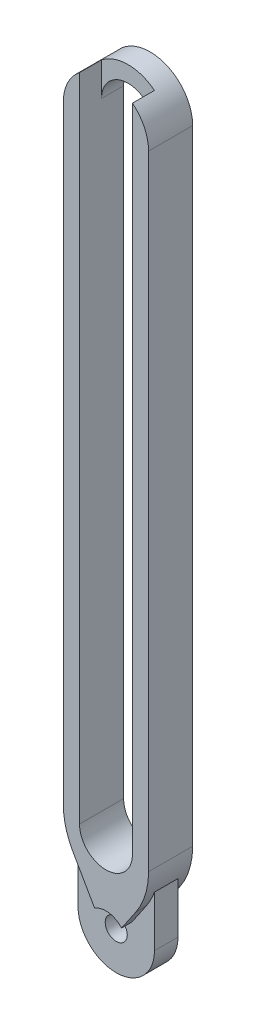
ISO-10303-21;
HEADER;
FILE_DESCRIPTION(('STEP AP214'),'2;1');
FILE_NAME('part.step','',(''),(''),'','','');
FILE_SCHEMA(('AUTOMOTIVE_DESIGN { 1 0 10303 214 1 1 1 1 }'));
ENDSEC;
DATA;
#1=APPLICATION_CONTEXT('core data for automotive mechanical design processes');
#2=APPLICATION_PROTOCOL_DEFINITION('international standard','automotive_design',2000,#1);
#3=PRODUCT_CONTEXT('',#1,'mechanical');
#4=PRODUCT('Part','Part','',(#3));
#5=PRODUCT_RELATED_PRODUCT_CATEGORY('part','',(#4));
#6=PRODUCT_DEFINITION_FORMATION('','',#4);
#7=PRODUCT_DEFINITION_CONTEXT('part definition',#1,'design');
#8=PRODUCT_DEFINITION('design','',#6,#7);
#9=PRODUCT_DEFINITION_SHAPE('','',#8);
#10=(LENGTH_UNIT() NAMED_UNIT(*) SI_UNIT(.MILLI.,.METRE.));
#11=(NAMED_UNIT(*) PLANE_ANGLE_UNIT() SI_UNIT($,.RADIAN.));
#12=(NAMED_UNIT(*) SI_UNIT($,.STERADIAN.) SOLID_ANGLE_UNIT());
#13=UNCERTAINTY_MEASURE_WITH_UNIT(LENGTH_MEASURE(1.E-05),#10,'distance_accuracy_value','');
#14=(GEOMETRIC_REPRESENTATION_CONTEXT(3) GLOBAL_UNCERTAINTY_ASSIGNED_CONTEXT((#13)) GLOBAL_UNIT_ASSIGNED_CONTEXT((#10,
#11,#12)) REPRESENTATION_CONTEXT('',''));
#15=CARTESIAN_POINT('',(0.,0.,0.));
#16=DIRECTION('',(0.,0.,1.));
#17=DIRECTION('',(1.,0.,0.));
#18=AXIS2_PLACEMENT_3D('',#15,#16,#17);
#19=CARTESIAN_POINT('',(0.,182.011383905916,-7.5));
#20=DIRECTION('',(0.,0.,1.));
#21=DIRECTION('',(1.,0.,0.));
#22=AXIS2_PLACEMENT_3D('',#19,#20,#21);
#23=CYLINDRICAL_SURFACE('',#22,9.);
#24=CARTESIAN_POINT('',(0.,182.011383905916,0.));
#25=DIRECTION('',(0.,0.,1.));
#26=DIRECTION('',(1.,0.,0.));
#27=AXIS2_PLACEMENT_3D('',#24,#25,#26);
#28=CIRCLE('',#27,9.);
#29=CARTESIAN_POINT('',(-9.,182.011383905916,0.));
#30=VERTEX_POINT('',#29);
#31=CARTESIAN_POINT('',(9.,182.011383905916,0.));
#32=VERTEX_POINT('',#31);
#33=EDGE_CURVE('E185',#30,#32,#28,.F.);
#34=ORIENTED_EDGE('',*,*,#33,.F.);
#35=DIRECTION('',(0.,0.,1.));
#36=VECTOR('',#35,1.);
#37=CARTESIAN_POINT('',(-9.,182.011383905916,-7.5));
#38=LINE('',#37,#36);
#39=CARTESIAN_POINT('',(-9.,182.011383905916,-7.5));
#40=VERTEX_POINT('',#39);
#41=EDGE_CURVE('E221',#40,#30,#38,.T.);
#42=ORIENTED_EDGE('',*,*,#41,.F.);
#43=CARTESIAN_POINT('',(0.,182.011383905916,-7.5));
#44=DIRECTION('',(0.,0.,1.));
#45=DIRECTION('',(1.,0.,0.));
#46=AXIS2_PLACEMENT_3D('',#43,#44,#45);
#47=CIRCLE('',#46,9.);
#48=CARTESIAN_POINT('',(9.,182.011383905916,-7.5));
#49=VERTEX_POINT('',#48);
#50=EDGE_CURVE('E206',#49,#40,#47,.T.);
#51=ORIENTED_EDGE('',*,*,#50,.F.);
#52=DIRECTION('',(0.,0.,1.));
#53=VECTOR('',#52,1.);
#54=CARTESIAN_POINT('',(9.,182.011383905916,-7.5));
#55=LINE('',#54,#53);
#56=EDGE_CURVE('E200',#49,#32,#55,.T.);
#57=ORIENTED_EDGE('',*,*,#56,.T.);
#58=EDGE_LOOP('',(#34,#42,#51,#57));
#59=FACE_BOUND('',#58,.T.);
#60=ADVANCED_FACE('F37',(#59),#23,.F.);
#61=CARTESIAN_POINT('',(5.29445936964023,-51.4874567844259,7.5));
#62=DIRECTION('',(0.826176472958624,-0.563411426516758,0.));
#63=DIRECTION('',(0.563411426516758,0.826176472958624,0.));
#64=AXIS2_PLACEMENT_3D('',#61,#62,#63);
#65=PLANE('',#64);
#66=DIRECTION('',(-0.563411426516758,-0.826176472958624,0.));
#67=VECTOR('',#66,1.);
#68=CARTESIAN_POINT('',(5.29445936964023,-51.4874567844259,-7.5));
#69=LINE('',#68,#67);
#70=CARTESIAN_POINT('',(10.1544118239656,-44.3609091347187,-7.5));
#71=VERTEX_POINT('',#70);
#72=CARTESIAN_POINT('',(5.29445936964023,-51.4874567844259,-7.5));
#73=VERTEX_POINT('',#72);
#74=EDGE_CURVE('E230',#71,#73,#69,.T.);
#75=ORIENTED_EDGE('',*,*,#74,.F.);
#76=DIRECTION('',(0.,0.,-1.));
#77=VECTOR('',#76,1.);
#78=CARTESIAN_POINT('',(10.1544118239656,-44.3609091347187,7.5));
#79=LINE('',#78,#77);
#80=CARTESIAN_POINT('',(10.1544118239656,-44.3609091347187,-4.));
#81=VERTEX_POINT('',#80);
#82=EDGE_CURVE('E328',#71,#81,#79,.F.);
#83=ORIENTED_EDGE('',*,*,#82,.T.);
#84=DIRECTION('',(-0.563411426516758,-0.826176472958624,0.));
#85=VECTOR('',#84,1.);
#86=CARTESIAN_POINT('',(5.29445936964023,-51.4874567844259,-4.));
#87=LINE('',#86,#85);
#88=CARTESIAN_POINT('',(5.29445936964023,-51.4874567844259,-4.));
#89=VERTEX_POINT('',#88);
#90=EDGE_CURVE('E239',#81,#89,#87,.T.);
#91=ORIENTED_EDGE('',*,*,#90,.T.);
#92=DIRECTION('',(0.,0.,1.));
#93=VECTOR('',#92,1.);
#94=CARTESIAN_POINT('',(5.29445936964023,-51.4874567844259,-7.5));
#95=LINE('',#94,#93);
#96=EDGE_CURVE('E244',#73,#89,#95,.T.);
#97=ORIENTED_EDGE('',*,*,#96,.F.);
#98=EDGE_LOOP('',(#75,#83,#91,#97));
#99=FACE_BOUND('',#98,.T.);
#100=ADVANCED_FACE('F387',(#99),#65,.T.);
#101=CARTESIAN_POINT('',(-3.84583251699359,-50.2177211342446,7.5));
#102=DIRECTION('',(-0.868365907058973,-0.495924037991352,0.));
#103=DIRECTION('',(0.495924037991352,-0.868365907058973,0.));
#104=AXIS2_PLACEMENT_3D('',#101,#102,#103);
#105=PLANE('',#104);
#106=DIRECTION('',(-0.495924037991352,0.868365907058973,0.));
#107=VECTOR('',#106,1.);
#108=CARTESIAN_POINT('',(-3.84583251699359,-50.2177211342446,7.5));
#109=LINE('',#108,#107);
#110=CARTESIAN_POINT('',(-3.84583251699359,-50.2177211342446,7.5));
#111=VERTEX_POINT('',#110);
#112=CARTESIAN_POINT('',(-11.2091476764743,-37.3245129862358,7.5));
#113=VERTEX_POINT('',#112);
#114=EDGE_CURVE('E250',#111,#113,#109,.T.);
#115=ORIENTED_EDGE('',*,*,#114,.T.);
#116=DIRECTION('',(0.,0.,-1.));
#117=VECTOR('',#116,1.);
#118=CARTESIAN_POINT('',(-11.2091476764743,-37.3245129862358,-7.5));
#119=LINE('',#118,#117);
#120=CARTESIAN_POINT('',(-11.2091476764743,-37.3245129862358,4.));
#121=VERTEX_POINT('',#120);
#122=EDGE_CURVE('E310',#113,#121,#119,.T.);
#123=ORIENTED_EDGE('',*,*,#122,.T.);
#124=DIRECTION('',(-0.495924037991352,0.868365907058973,0.));
#125=VECTOR('',#124,1.);
#126=CARTESIAN_POINT('',(-3.84583251699359,-50.2177211342446,4.));
#127=LINE('',#126,#125);
#128=CARTESIAN_POINT('',(-3.84583251699359,-50.2177211342446,4.));
#129=VERTEX_POINT('',#128);
#130=EDGE_CURVE('E259',#129,#121,#127,.T.);
#131=ORIENTED_EDGE('',*,*,#130,.F.);
#132=DIRECTION('',(0.,0.,-1.));
#133=VECTOR('',#132,1.);
#134=CARTESIAN_POINT('',(-3.84583251699359,-50.2177211342446,7.5));
#135=LINE('',#134,#133);
#136=EDGE_CURVE('E265',#111,#129,#135,.T.);
#137=ORIENTED_EDGE('',*,*,#136,.F.);
#138=EDGE_LOOP('',(#115,#123,#131,#137));
#139=FACE_BOUND('',#138,.T.);
#140=ADVANCED_FACE('F362',(#139),#105,.T.);
#141=CARTESIAN_POINT('',(-14.5,182.011383905916,7.5));
#142=DIRECTION('',(1.,0.,0.));
#143=DIRECTION('',(0.,1.,0.));
#144=AXIS2_PLACEMENT_3D('',#141,#142,#143);
#145=PLANE('',#144);
#146=DIRECTION('',(0.,-1.,0.));
#147=VECTOR('',#146,1.);
#148=CARTESIAN_POINT('',(-14.5,182.011383905916,-7.5));
#149=LINE('',#148,#147);
#150=CARTESIAN_POINT('',(-14.5,182.011383905916,-7.5));
#151=VERTEX_POINT('',#150);
#152=CARTESIAN_POINT('',(-14.5,-24.926412036452,-7.5));
#153=VERTEX_POINT('',#152);
#154=EDGE_CURVE('E298',#151,#153,#149,.T.);
#155=ORIENTED_EDGE('',*,*,#154,.T.);
#156=DIRECTION('',(0.,0.,-1.));
#157=VECTOR('',#156,1.);
#158=CARTESIAN_POINT('',(-14.5,-24.926412036452,7.5));
#159=LINE('',#158,#157);
#160=CARTESIAN_POINT('',(-14.5,-24.926412036452,7.5));
#161=VERTEX_POINT('',#160);
#162=EDGE_CURVE('E317',#153,#161,#159,.F.);
#163=ORIENTED_EDGE('',*,*,#162,.T.);
#164=DIRECTION('',(0.,-1.,0.));
#165=VECTOR('',#164,1.);
#166=CARTESIAN_POINT('',(-14.5,182.011383905916,7.5));
#167=LINE('',#166,#165);
#168=CARTESIAN_POINT('',(-14.5,182.011383905916,7.5));
#169=VERTEX_POINT('',#168);
#170=EDGE_CURVE('E289',#169,#161,#167,.T.);
#171=ORIENTED_EDGE('',*,*,#170,.F.);
#172=DIRECTION('',(0.,0.,-1.));
#173=VECTOR('',#172,1.);
#174=CARTESIAN_POINT('',(-14.5,182.011383905916,7.5));
#175=LINE('',#174,#173);
#176=EDGE_CURVE('E305',#169,#151,#175,.T.);
#177=ORIENTED_EDGE('',*,*,#176,.T.);
#178=EDGE_LOOP('',(#155,#163,#171,#177));
#179=FACE_BOUND('',#178,.T.);
#180=ADVANCED_FACE('F409',(#179),#145,.F.);
#181=CARTESIAN_POINT('',(0.,182.011383905916,7.5));
#182=DIRECTION('',(0.,0.,1.));
#183=DIRECTION('',(1.,0.,0.));
#184=AXIS2_PLACEMENT_3D('',#181,#182,#183);
#185=PLANE('',#184);
#186=DIRECTION('',(0.,-1.,0.));
#187=VECTOR('',#186,1.);
#188=CARTESIAN_POINT('',(-9.,182.011383905916,7.5));
#189=LINE('',#188,#187);
#190=CARTESIAN_POINT('',(-9.,193.380200906818,7.5));
#191=VERTEX_POINT('',#190);
#192=CARTESIAN_POINT('',(-8.99999999999998,-27.988616094084,7.5));
#193=VERTEX_POINT('',#192);
#194=EDGE_CURVE('E415',#191,#193,#189,.T.);
#195=ORIENTED_EDGE('',*,*,#194,.F.);
#196=CARTESIAN_POINT('',(0.,182.011383905916,7.5));
#197=DIRECTION('',(0.,0.,1.));
#198=DIRECTION('',(1.,0.,0.));
#199=AXIS2_PLACEMENT_3D('',#196,#197,#198);
#200=CIRCLE('',#199,14.5);
#201=EDGE_CURVE('E290',#191,#169,#200,.T.);
#202=ORIENTED_EDGE('',*,*,#201,.T.);
#203=ORIENTED_EDGE('',*,*,#170,.T.);
#204=CARTESIAN_POINT('',(10.5,-24.926412036452,7.5));
#205=DIRECTION('',(0.,0.,1.));
#206=DIRECTION('',(1.,0.,0.));
#207=AXIS2_PLACEMENT_3D('',#204,#205,#206);
#208=CIRCLE('',#207,25.);
#209=EDGE_CURVE('E321',#161,#113,#208,.T.);
#210=ORIENTED_EDGE('',*,*,#209,.T.);
#211=ORIENTED_EDGE('',*,*,#114,.F.);
#212=CARTESIAN_POINT('',(0.,-56.066616094084,7.5));
#213=DIRECTION('',(0.,0.,1.));
#214=DIRECTION('',(1.,0.,0.));
#215=AXIS2_PLACEMENT_3D('',#212,#213,#214);
#216=CIRCLE('',#215,7.);
#217=CARTESIAN_POINT('',(5.29445936964023,-51.4874567844259,7.5));
#218=VERTEX_POINT('',#217);
#219=EDGE_CURVE('E248',#218,#111,#216,.T.);
#220=ORIENTED_EDGE('',*,*,#219,.F.);
#221=DIRECTION('',(-0.563411426516758,-0.826176472958624,0.));
#222=VECTOR('',#221,1.);
#223=CARTESIAN_POINT('',(5.29445936964023,-51.4874567844259,7.5));
#224=LINE('',#223,#222);
#225=CARTESIAN_POINT('',(10.1544118239656,-44.3609091347187,7.5));
#226=VERTEX_POINT('',#225);
#227=EDGE_CURVE('E254',#226,#218,#224,.T.);
#228=ORIENTED_EDGE('',*,*,#227,.F.);
#229=CARTESIAN_POINT('',(-10.5,-30.2756234717997,7.5));
#230=DIRECTION('',(0.,0.,1.));
#231=DIRECTION('',(1.,0.,0.));
#232=AXIS2_PLACEMENT_3D('',#229,#230,#231);
#233=CIRCLE('',#232,25.);
#234=CARTESIAN_POINT('',(14.5,-30.2756234717997,7.5));
#235=VERTEX_POINT('',#234);
#236=EDGE_CURVE('E319',#226,#235,#233,.T.);
#237=ORIENTED_EDGE('',*,*,#236,.T.);
#238=DIRECTION('',(0.,1.,0.));
#239=VECTOR('',#238,1.);
#240=CARTESIAN_POINT('',(14.5,182.011383905916,7.5));
#241=LINE('',#240,#239);
#242=CARTESIAN_POINT('',(14.5,182.011383905916,7.5));
#243=VERTEX_POINT('',#242);
#244=EDGE_CURVE('E293',#235,#243,#241,.T.);
#245=ORIENTED_EDGE('',*,*,#244,.T.);
#246=CARTESIAN_POINT('',(9.,193.380200906818,7.5));
#247=VERTEX_POINT('',#246);
#248=EDGE_CURVE('E286',#243,#247,#200,.T.);
#249=ORIENTED_EDGE('',*,*,#248,.T.);
#250=DIRECTION('',(0.,1.,0.));
#251=VECTOR('',#250,1.);
#252=CARTESIAN_POINT('',(9.,182.011383905916,7.5));
#253=LINE('',#252,#251);
#254=CARTESIAN_POINT('',(9.00000000000003,-27.988616094084,7.5));
#255=VERTEX_POINT('',#254);
#256=EDGE_CURVE('E217',#255,#247,#253,.T.);
#257=ORIENTED_EDGE('',*,*,#256,.F.);
#258=CARTESIAN_POINT('',(0.,-27.988616094084,7.5));
#259=DIRECTION('',(0.,0.,1.));
#260=DIRECTION('',(1.,0.,0.));
#261=AXIS2_PLACEMENT_3D('',#258,#259,#260);
#262=CIRCLE('',#261,9.);
#263=EDGE_CURVE('E417',#193,#255,#262,.T.);
#264=ORIENTED_EDGE('',*,*,#263,.F.);
#265=EDGE_LOOP('',(#195,#202,#203,#210,#211,#220,#228,#237,#245,#249,#257,#264));
#266=FACE_BOUND('',#265,.T.);
#267=ADVANCED_FACE('F405',(#266),#185,.T.);
#268=CARTESIAN_POINT('',(0.,182.011383905916,7.5));
#269=DIRECTION('',(0.,0.,-1.));
#270=DIRECTION('',(-1.,0.,0.));
#271=AXIS2_PLACEMENT_3D('',#268,#269,#270);
#272=CYLINDRICAL_SURFACE('',#271,14.5);
#273=ORIENTED_EDGE('',*,*,#201,.F.);
#274=DIRECTION('',(0.,0.,-1.));
#275=VECTOR('',#274,1.);
#276=CARTESIAN_POINT('',(-9.,193.380200906818,7.5));
#277=LINE('',#276,#275);
#278=CARTESIAN_POINT('',(-9.,193.380200906818,0.));
#279=VERTEX_POINT('',#278);
#280=EDGE_CURVE('E412',#191,#279,#277,.T.);
#281=ORIENTED_EDGE('',*,*,#280,.T.);
#282=CARTESIAN_POINT('',(0.,182.011383905916,0.));
#283=DIRECTION('',(0.,0.,1.));
#284=DIRECTION('',(1.,0.,0.));
#285=AXIS2_PLACEMENT_3D('',#282,#283,#284);
#286=CIRCLE('',#285,14.5);
#287=CARTESIAN_POINT('',(9.,193.380200906818,0.));
#288=VERTEX_POINT('',#287);
#289=EDGE_CURVE('E195',#288,#279,#286,.T.);
#290=ORIENTED_EDGE('',*,*,#289,.F.);
#291=DIRECTION('',(0.,0.,-1.));
#292=VECTOR('',#291,1.);
#293=CARTESIAN_POINT('',(9.,193.380200906818,7.5));
#294=LINE('',#293,#292);
#295=EDGE_CURVE('E203',#288,#247,#294,.F.);
#296=ORIENTED_EDGE('',*,*,#295,.T.);
#297=ORIENTED_EDGE('',*,*,#248,.F.);
#298=DIRECTION('',(0.,0.,-1.));
#299=VECTOR('',#298,1.);
#300=CARTESIAN_POINT('',(14.5,182.011383905916,7.5));
#301=LINE('',#300,#299);
#302=CARTESIAN_POINT('',(14.5,182.011383905916,-7.5));
#303=VERTEX_POINT('',#302);
#304=EDGE_CURVE('E295',#243,#303,#301,.T.);
#305=ORIENTED_EDGE('',*,*,#304,.T.);
#306=CARTESIAN_POINT('',(0.,182.011383905916,-7.5));
#307=DIRECTION('',(0.,0.,1.));
#308=DIRECTION('',(1.,0.,0.));
#309=AXIS2_PLACEMENT_3D('',#306,#307,#308);
#310=CIRCLE('',#309,14.5);
#311=EDGE_CURVE('E285',#303,#151,#310,.T.);
#312=ORIENTED_EDGE('',*,*,#311,.T.);
#313=ORIENTED_EDGE('',*,*,#176,.F.);
#314=EDGE_LOOP('',(#273,#281,#290,#296,#297,#305,#312,#313));
#315=FACE_BOUND('',#314,.T.);
#316=ADVANCED_FACE('F401',(#315),#272,.T.);
#317=CARTESIAN_POINT('',(14.5,182.011383905916,7.5));
#318=DIRECTION('',(-1.,0.,0.));
#319=DIRECTION('',(0.,-1.,0.));
#320=AXIS2_PLACEMENT_3D('',#317,#318,#319);
#321=PLANE('',#320);
#322=ORIENTED_EDGE('',*,*,#244,.F.);
#323=DIRECTION('',(0.,0.,-1.));
#324=VECTOR('',#323,1.);
#325=CARTESIAN_POINT('',(14.5,-30.2756234717997,-7.5));
#326=LINE('',#325,#324);
#327=CARTESIAN_POINT('',(14.5,-30.2756234717997,-7.5));
#328=VERTEX_POINT('',#327);
#329=EDGE_CURVE('E323',#235,#328,#326,.T.);
#330=ORIENTED_EDGE('',*,*,#329,.T.);
#331=DIRECTION('',(0.,1.,0.));
#332=VECTOR('',#331,1.);
#333=CARTESIAN_POINT('',(14.5,182.011383905916,-7.5));
#334=LINE('',#333,#332);
#335=EDGE_CURVE('E301',#328,#303,#334,.T.);
#336=ORIENTED_EDGE('',*,*,#335,.T.);
#337=ORIENTED_EDGE('',*,*,#304,.F.);
#338=EDGE_LOOP('',(#322,#330,#336,#337));
#339=FACE_BOUND('',#338,.T.);
#340=ADVANCED_FACE('F397',(#339),#321,.F.);
#341=CARTESIAN_POINT('',(0.,182.011383905916,-7.5));
#342=DIRECTION('',(0.,0.,1.));
#343=DIRECTION('',(1.,0.,0.));
#344=AXIS2_PLACEMENT_3D('',#341,#342,#343);
#345=PLANE('',#344);
#346=DIRECTION('',(0.,1.,0.));
#347=VECTOR('',#346,1.);
#348=CARTESIAN_POINT('',(9.,182.011383905916,-7.5));
#349=LINE('',#348,#347);
#350=CARTESIAN_POINT('',(9.00000000000003,-27.988616094084,-7.5));
#351=VERTEX_POINT('',#350);
#352=EDGE_CURVE('E222',#351,#49,#349,.T.);
#353=ORIENTED_EDGE('',*,*,#352,.T.);
#354=ORIENTED_EDGE('',*,*,#50,.T.);
#355=DIRECTION('',(0.,-1.,0.));
#356=VECTOR('',#355,1.);
#357=CARTESIAN_POINT('',(-9.,182.011383905916,-7.5));
#358=LINE('',#357,#356);
#359=CARTESIAN_POINT('',(-8.99999999999998,-27.988616094084,-7.5));
#360=VERTEX_POINT('',#359);
#361=EDGE_CURVE('E423',#40,#360,#358,.T.);
#362=ORIENTED_EDGE('',*,*,#361,.T.);
#363=CARTESIAN_POINT('',(0.,-27.988616094084,-7.5));
#364=DIRECTION('',(0.,0.,1.));
#365=DIRECTION('',(1.,0.,0.));
#366=AXIS2_PLACEMENT_3D('',#363,#364,#365);
#367=CIRCLE('',#366,9.);
#368=EDGE_CURVE('E52',#360,#351,#367,.T.);
#369=ORIENTED_EDGE('',*,*,#368,.T.);
#370=EDGE_LOOP('',(#353,#354,#362,#369));
#371=FACE_BOUND('',#370,.T.);
#372=DIRECTION('',(-0.495924037991352,0.868365907058973,0.));
#373=VECTOR('',#372,1.);
#374=CARTESIAN_POINT('',(-3.84583251699359,-50.2177211342446,-7.5));
#375=LINE('',#374,#373);
#376=CARTESIAN_POINT('',(-3.84583251699359,-50.2177211342446,-7.5));
#377=VERTEX_POINT('',#376);
#378=CARTESIAN_POINT('',(-11.2091476764743,-37.3245129862358,-7.5));
#379=VERTEX_POINT('',#378);
#380=EDGE_CURVE('E233',#377,#379,#375,.T.);
#381=ORIENTED_EDGE('',*,*,#380,.T.);
#382=CARTESIAN_POINT('',(10.5,-24.926412036452,-7.5));
#383=DIRECTION('',(0.,0.,1.));
#384=DIRECTION('',(1.,0.,0.));
#385=AXIS2_PLACEMENT_3D('',#382,#383,#384);
#386=CIRCLE('',#385,25.);
#387=EDGE_CURVE('E315',#379,#153,#386,.F.);
#388=ORIENTED_EDGE('',*,*,#387,.T.);
#389=ORIENTED_EDGE('',*,*,#154,.F.);
#390=ORIENTED_EDGE('',*,*,#311,.F.);
#391=ORIENTED_EDGE('',*,*,#335,.F.);
#392=CARTESIAN_POINT('',(-10.5,-30.2756234717997,-7.5));
#393=DIRECTION('',(0.,0.,1.));
#394=DIRECTION('',(1.,0.,0.));
#395=AXIS2_PLACEMENT_3D('',#392,#393,#394);
#396=CIRCLE('',#395,25.);
#397=EDGE_CURVE('E313',#328,#71,#396,.F.);
#398=ORIENTED_EDGE('',*,*,#397,.T.);
#399=ORIENTED_EDGE('',*,*,#74,.T.);
#400=CARTESIAN_POINT('',(0.,-56.066616094084,-7.5));
#401=DIRECTION('',(0.,0.,1.));
#402=DIRECTION('',(1.,0.,0.));
#403=AXIS2_PLACEMENT_3D('',#400,#401,#402);
#404=CIRCLE('',#403,7.);
#405=EDGE_CURVE('E227',#73,#377,#404,.T.);
#406=ORIENTED_EDGE('',*,*,#405,.T.);
#407=EDGE_LOOP('',(#381,#388,#389,#390,#391,#398,#399,#406));
#408=FACE_BOUND('',#407,.T.);
#409=ADVANCED_FACE('F391',(#371,#408),#345,.F.);
#410=CARTESIAN_POINT('',(-13.,-40.066616094084,4.));
#411=DIRECTION('',(1.,0.,0.));
#412=DIRECTION('',(0.,1.,0.));
#413=AXIS2_PLACEMENT_3D('',#410,#411,#412);
#414=PLANE('',#413);
#415=DIRECTION('',(0.,-1.,0.));
#416=VECTOR('',#415,1.);
#417=CARTESIAN_POINT('',(-13.,-40.066616094084,4.));
#418=LINE('',#417,#416);
#419=CARTESIAN_POINT('',(-13.,-33.4557730910679,4.));
#420=VERTEX_POINT('',#419);
#421=CARTESIAN_POINT('',(-13.,-56.066616094084,4.));
#422=VERTEX_POINT('',#421);
#423=EDGE_CURVE('E269',#420,#422,#418,.T.);
#424=ORIENTED_EDGE('',*,*,#423,.F.);
#425=DIRECTION('',(0.,0.,1.));
#426=VECTOR('',#425,1.);
#427=CARTESIAN_POINT('',(-13.,-33.4557730910679,4.));
#428=LINE('',#427,#426);
#429=CARTESIAN_POINT('',(-13.,-33.4557730910679,-4.));
#430=VERTEX_POINT('',#429);
#431=EDGE_CURVE('E333',#420,#430,#428,.F.);
#432=ORIENTED_EDGE('',*,*,#431,.T.);
#433=DIRECTION('',(0.,-1.,0.));
#434=VECTOR('',#433,1.);
#435=CARTESIAN_POINT('',(-13.,-40.066616094084,-4.));
#436=LINE('',#435,#434);
#437=CARTESIAN_POINT('',(-13.,-56.066616094084,-4.));
#438=VERTEX_POINT('',#437);
#439=EDGE_CURVE('E268',#430,#438,#436,.T.);
#440=ORIENTED_EDGE('',*,*,#439,.T.);
#441=DIRECTION('',(0.,0.,-1.));
#442=VECTOR('',#441,1.);
#443=CARTESIAN_POINT('',(-13.,-56.066616094084,4.));
#444=LINE('',#443,#442);
#445=EDGE_CURVE('E282',#422,#438,#444,.T.);
#446=ORIENTED_EDGE('',*,*,#445,.F.);
#447=EDGE_LOOP('',(#424,#432,#440,#446));
#448=FACE_BOUND('',#447,.T.);
#449=ADVANCED_FACE('F372',(#448),#414,.F.);
#450=CARTESIAN_POINT('',(13.,-40.066616094084,4.));
#451=DIRECTION('',(-1.,0.,0.));
#452=DIRECTION('',(0.,-1.,0.));
#453=AXIS2_PLACEMENT_3D('',#450,#451,#452);
#454=PLANE('',#453);
#455=DIRECTION('',(0.,1.,0.));
#456=VECTOR('',#455,1.);
#457=CARTESIAN_POINT('',(13.,-40.066616094084,-4.));
#458=LINE('',#457,#456);
#459=CARTESIAN_POINT('',(13.,-56.066616094084,-4.));
#460=VERTEX_POINT('',#459);
#461=CARTESIAN_POINT('',(13.,-38.8049845264158,-4.));
#462=VERTEX_POINT('',#461);
#463=EDGE_CURVE('E272',#460,#462,#458,.T.);
#464=ORIENTED_EDGE('',*,*,#463,.T.);
#465=DIRECTION('',(0.,0.,1.));
#466=VECTOR('',#465,1.);
#467=CARTESIAN_POINT('',(13.,-38.8049845264158,-4.));
#468=LINE('',#467,#466);
#469=CARTESIAN_POINT('',(13.,-38.8049845264158,4.));
#470=VERTEX_POINT('',#469);
#471=EDGE_CURVE('E45',#462,#470,#468,.T.);
#472=ORIENTED_EDGE('',*,*,#471,.T.);
#473=DIRECTION('',(0.,1.,0.));
#474=VECTOR('',#473,1.);
#475=CARTESIAN_POINT('',(13.,-40.066616094084,4.));
#476=LINE('',#475,#474);
#477=CARTESIAN_POINT('',(13.,-56.066616094084,4.));
#478=VERTEX_POINT('',#477);
#479=EDGE_CURVE('E59',#478,#470,#476,.T.);
#480=ORIENTED_EDGE('',*,*,#479,.F.);
#481=DIRECTION('',(0.,0.,-1.));
#482=VECTOR('',#481,1.);
#483=CARTESIAN_POINT('',(13.,-56.066616094084,4.));
#484=LINE('',#483,#482);
#485=EDGE_CURVE('E275',#478,#460,#484,.T.);
#486=ORIENTED_EDGE('',*,*,#485,.T.);
#487=EDGE_LOOP('',(#464,#472,#480,#486));
#488=FACE_BOUND('',#487,.T.);
#489=ADVANCED_FACE('F343',(#488),#454,.F.);
#490=CARTESIAN_POINT('',(0.,-56.066616094084,4.));
#491=DIRECTION('',(0.,0.,-1.));
#492=DIRECTION('',(-1.,0.,0.));
#493=AXIS2_PLACEMENT_3D('',#490,#491,#492);
#494=CYLINDRICAL_SURFACE('',#493,13.);
#495=CARTESIAN_POINT('',(0.,-56.066616094084,-4.));
#496=DIRECTION('',(0.,0.,1.));
#497=DIRECTION('',(1.,0.,0.));
#498=AXIS2_PLACEMENT_3D('',#495,#496,#497);
#499=CIRCLE('',#498,13.);
#500=EDGE_CURVE('E277',#438,#460,#499,.T.);
#501=ORIENTED_EDGE('',*,*,#500,.T.);
#502=ORIENTED_EDGE('',*,*,#485,.F.);
#503=CARTESIAN_POINT('',(0.,-56.066616094084,4.));
#504=DIRECTION('',(0.,0.,1.));
#505=DIRECTION('',(1.,0.,0.));
#506=AXIS2_PLACEMENT_3D('',#503,#504,#505);
#507=CIRCLE('',#506,13.);
#508=EDGE_CURVE('E271',#422,#478,#507,.T.);
#509=ORIENTED_EDGE('',*,*,#508,.F.);
#510=ORIENTED_EDGE('',*,*,#445,.T.);
#511=EDGE_LOOP('',(#501,#502,#509,#510));
#512=FACE_BOUND('',#511,.T.);
#513=ADVANCED_FACE('F377',(#512),#494,.T.);
#514=CARTESIAN_POINT('',(0.,-40.066616094084,4.));
#515=DIRECTION('',(0.,0.,1.));
#516=DIRECTION('',(1.,0.,0.));
#517=AXIS2_PLACEMENT_3D('',#514,#515,#516);
#518=PLANE('',#517);
#519=CARTESIAN_POINT('',(0.,-56.066616094084,4.));
#520=DIRECTION('',(0.,0.,1.));
#521=DIRECTION('',(1.,0.,0.));
#522=AXIS2_PLACEMENT_3D('',#519,#520,#521);
#523=CIRCLE('',#522,3.74999999999999);
#524=CARTESIAN_POINT('',(3.74999999999999,-56.066616094084,4.));
#525=VERTEX_POINT('',#524);
#526=EDGE_CURVE('E208',#525,#525,#523,.T.);
#527=ORIENTED_EDGE('',*,*,#526,.F.);
#528=EDGE_LOOP('',(#527));
#529=FACE_BOUND('',#528,.T.);
#530=ORIENTED_EDGE('',*,*,#130,.T.);
#531=CARTESIAN_POINT('',(10.5,-24.926412036452,4.));
#532=DIRECTION('',(0.,0.,1.));
#533=DIRECTION('',(1.,0.,0.));
#534=AXIS2_PLACEMENT_3D('',#531,#532,#533);
#535=CIRCLE('',#534,25.);
#536=EDGE_CURVE('E330',#121,#420,#535,.F.);
#537=ORIENTED_EDGE('',*,*,#536,.T.);
#538=ORIENTED_EDGE('',*,*,#423,.T.);
#539=ORIENTED_EDGE('',*,*,#508,.T.);
#540=ORIENTED_EDGE('',*,*,#479,.T.);
#541=CARTESIAN_POINT('',(-10.5,-30.2756234717997,4.));
#542=DIRECTION('',(0.,0.,1.));
#543=DIRECTION('',(1.,0.,0.));
#544=AXIS2_PLACEMENT_3D('',#541,#542,#543);
#545=CIRCLE('',#544,25.);
#546=CARTESIAN_POINT('',(10.1544118239656,-44.3609091347187,4.));
#547=VERTEX_POINT('',#546);
#548=EDGE_CURVE('E11',#470,#547,#545,.F.);
#549=ORIENTED_EDGE('',*,*,#548,.T.);
#550=DIRECTION('',(-0.563411426516758,-0.826176472958624,0.));
#551=VECTOR('',#550,1.);
#552=CARTESIAN_POINT('',(5.29445936964023,-51.4874567844259,4.));
#553=LINE('',#552,#551);
#554=CARTESIAN_POINT('',(5.29445936964023,-51.4874567844259,4.));
#555=VERTEX_POINT('',#554);
#556=EDGE_CURVE('E251',#547,#555,#553,.T.);
#557=ORIENTED_EDGE('',*,*,#556,.T.);
#558=CARTESIAN_POINT('',(0.,-56.066616094084,4.));
#559=DIRECTION('',(0.,0.,1.));
#560=DIRECTION('',(1.,0.,0.));
#561=AXIS2_PLACEMENT_3D('',#558,#559,#560);
#562=CIRCLE('',#561,7.);
#563=EDGE_CURVE('E247',#555,#129,#562,.T.);
#564=ORIENTED_EDGE('',*,*,#563,.T.);
#565=EDGE_LOOP('',(#530,#537,#538,#539,#540,#549,#557,#564));
#566=FACE_BOUND('',#565,.T.);
#567=ADVANCED_FACE('F350',(#529,#566),#518,.T.);
#568=CARTESIAN_POINT('',(0.,-40.066616094084,-4.));
#569=DIRECTION('',(0.,0.,1.));
#570=DIRECTION('',(1.,0.,0.));
#571=AXIS2_PLACEMENT_3D('',#568,#569,#570);
#572=PLANE('',#571);
#573=CARTESIAN_POINT('',(0.,-56.066616094084,-4.));
#574=DIRECTION('',(0.,0.,1.));
#575=DIRECTION('',(1.,0.,0.));
#576=AXIS2_PLACEMENT_3D('',#573,#574,#575);
#577=CIRCLE('',#576,3.74999999999999);
#578=CARTESIAN_POINT('',(3.74999999999999,-56.066616094084,-4.));
#579=VERTEX_POINT('',#578);
#580=EDGE_CURVE('E212',#579,#579,#577,.T.);
#581=ORIENTED_EDGE('',*,*,#580,.T.);
#582=EDGE_LOOP('',(#581));
#583=FACE_BOUND('',#582,.T.);
#584=ORIENTED_EDGE('',*,*,#439,.F.);
#585=CARTESIAN_POINT('',(10.5,-24.926412036452,-4.));
#586=DIRECTION('',(0.,0.,1.));
#587=DIRECTION('',(1.,0.,0.));
#588=AXIS2_PLACEMENT_3D('',#585,#586,#587);
#589=CIRCLE('',#588,25.);
#590=CARTESIAN_POINT('',(-11.2091476764743,-37.3245129862358,-4.));
#591=VERTEX_POINT('',#590);
#592=EDGE_CURVE('E336',#430,#591,#589,.T.);
#593=ORIENTED_EDGE('',*,*,#592,.T.);
#594=DIRECTION('',(-0.495924037991352,0.868365907058973,0.));
#595=VECTOR('',#594,1.);
#596=CARTESIAN_POINT('',(-3.84583251699359,-50.2177211342446,-4.));
#597=LINE('',#596,#595);
#598=CARTESIAN_POINT('',(-3.84583251699359,-50.2177211342446,-4.));
#599=VERTEX_POINT('',#598);
#600=EDGE_CURVE('E231',#599,#591,#597,.T.);
#601=ORIENTED_EDGE('',*,*,#600,.F.);
#602=CARTESIAN_POINT('',(0.,-56.066616094084,-4.));
#603=DIRECTION('',(0.,0.,1.));
#604=DIRECTION('',(1.,0.,0.));
#605=AXIS2_PLACEMENT_3D('',#602,#603,#604);
#606=CIRCLE('',#605,7.);
#607=EDGE_CURVE('E226',#89,#599,#606,.T.);
#608=ORIENTED_EDGE('',*,*,#607,.F.);
#609=ORIENTED_EDGE('',*,*,#90,.F.);
#610=CARTESIAN_POINT('',(-10.5,-30.2756234717997,-4.));
#611=DIRECTION('',(0.,0.,1.));
#612=DIRECTION('',(1.,0.,0.));
#613=AXIS2_PLACEMENT_3D('',#610,#611,#612);
#614=CIRCLE('',#613,25.);
#615=EDGE_CURVE('E338',#81,#462,#614,.T.);
#616=ORIENTED_EDGE('',*,*,#615,.T.);
#617=ORIENTED_EDGE('',*,*,#463,.F.);
#618=ORIENTED_EDGE('',*,*,#500,.F.);
#619=EDGE_LOOP('',(#584,#593,#601,#608,#609,#616,#617,#618));
#620=FACE_BOUND('',#619,.T.);
#621=ADVANCED_FACE('F380',(#583,#620),#572,.F.);
#622=CARTESIAN_POINT('',(0.,-56.066616094084,7.5));
#623=DIRECTION('',(0.,0.,-1.));
#624=DIRECTION('',(-1.,0.,0.));
#625=AXIS2_PLACEMENT_3D('',#622,#623,#624);
#626=CYLINDRICAL_SURFACE('',#625,7.);
#627=ORIENTED_EDGE('',*,*,#563,.F.);
#628=DIRECTION('',(0.,0.,-1.));
#629=VECTOR('',#628,1.);
#630=CARTESIAN_POINT('',(5.29445936964023,-51.4874567844259,7.5));
#631=LINE('',#630,#629);
#632=EDGE_CURVE('E256',#218,#555,#631,.T.);
#633=ORIENTED_EDGE('',*,*,#632,.F.);
#634=ORIENTED_EDGE('',*,*,#219,.T.);
#635=ORIENTED_EDGE('',*,*,#136,.T.);
#636=EDGE_LOOP('',(#627,#633,#634,#635));
#637=FACE_BOUND('',#636,.T.);
#638=ADVANCED_FACE('F358',(#637),#626,.F.);
#639=ORIENTED_EDGE('',*,*,#600,.T.);
#640=DIRECTION('',(0.,0.,-1.));
#641=VECTOR('',#640,1.);
#642=CARTESIAN_POINT('',(-11.2091476764743,-37.3245129862358,-7.5));
#643=LINE('',#642,#641);
#644=EDGE_CURVE('E308',#591,#379,#643,.T.);
#645=ORIENTED_EDGE('',*,*,#644,.T.);
#646=ORIENTED_EDGE('',*,*,#380,.F.);
#647=DIRECTION('',(0.,0.,1.));
#648=VECTOR('',#647,1.);
#649=CARTESIAN_POINT('',(-3.84583251699359,-50.2177211342446,-7.5));
#650=LINE('',#649,#648);
#651=EDGE_CURVE('E236',#377,#599,#650,.T.);
#652=ORIENTED_EDGE('',*,*,#651,.T.);
#653=EDGE_LOOP('',(#639,#645,#646,#652));
#654=FACE_BOUND('',#653,.T.);
#655=ADVANCED_FACE('F454',(#654),#105,.T.);
#656=ORIENTED_EDGE('',*,*,#556,.F.);
#657=DIRECTION('',(0.,0.,-1.));
#658=VECTOR('',#657,1.);
#659=CARTESIAN_POINT('',(10.1544118239656,-44.3609091347187,7.5));
#660=LINE('',#659,#658);
#661=EDGE_CURVE('E326',#547,#226,#660,.F.);
#662=ORIENTED_EDGE('',*,*,#661,.T.);
#663=ORIENTED_EDGE('',*,*,#227,.T.);
#664=ORIENTED_EDGE('',*,*,#632,.T.);
#665=EDGE_LOOP('',(#656,#662,#663,#664));
#666=FACE_BOUND('',#665,.T.);
#667=ADVANCED_FACE('F352',(#666),#65,.T.);
#668=CARTESIAN_POINT('',(0.,-56.066616094084,-7.5));
#669=DIRECTION('',(0.,0.,1.));
#670=DIRECTION('',(1.,0.,0.));
#671=AXIS2_PLACEMENT_3D('',#668,#669,#670);
#672=CYLINDRICAL_SURFACE('',#671,7.);
#673=ORIENTED_EDGE('',*,*,#607,.T.);
#674=ORIENTED_EDGE('',*,*,#651,.F.);
#675=ORIENTED_EDGE('',*,*,#405,.F.);
#676=ORIENTED_EDGE('',*,*,#96,.T.);
#677=EDGE_LOOP('',(#673,#674,#675,#676));
#678=FACE_BOUND('',#677,.T.);
#679=ADVANCED_FACE('F449',(#678),#672,.F.);
#680=CARTESIAN_POINT('',(10.5,-24.926412036452,7.5));
#681=DIRECTION('',(0.,0.,1.));
#682=DIRECTION('',(1.,0.,0.));
#683=AXIS2_PLACEMENT_3D('',#680,#681,#682);
#684=CYLINDRICAL_SURFACE('',#683,25.);
#685=ORIENTED_EDGE('',*,*,#209,.F.);
#686=ORIENTED_EDGE('',*,*,#162,.F.);
#687=ORIENTED_EDGE('',*,*,#387,.F.);
#688=ORIENTED_EDGE('',*,*,#644,.F.);
#689=ORIENTED_EDGE('',*,*,#592,.F.);
#690=ORIENTED_EDGE('',*,*,#431,.F.);
#691=ORIENTED_EDGE('',*,*,#536,.F.);
#692=ORIENTED_EDGE('',*,*,#122,.F.);
#693=EDGE_LOOP('',(#685,#686,#687,#688,#689,#690,#691,#692));
#694=FACE_BOUND('',#693,.T.);
#695=ADVANCED_FACE('F367',(#694),#684,.T.);
#696=CARTESIAN_POINT('',(-10.5,-30.2756234717997,7.5));
#697=DIRECTION('',(0.,0.,1.));
#698=DIRECTION('',(1.,0.,0.));
#699=AXIS2_PLACEMENT_3D('',#696,#697,#698);
#700=CYLINDRICAL_SURFACE('',#699,25.);
#701=ORIENTED_EDGE('',*,*,#615,.F.);
#702=ORIENTED_EDGE('',*,*,#82,.F.);
#703=ORIENTED_EDGE('',*,*,#397,.F.);
#704=ORIENTED_EDGE('',*,*,#329,.F.);
#705=ORIENTED_EDGE('',*,*,#236,.F.);
#706=ORIENTED_EDGE('',*,*,#661,.F.);
#707=ORIENTED_EDGE('',*,*,#548,.F.);
#708=ORIENTED_EDGE('',*,*,#471,.F.);
#709=EDGE_LOOP('',(#701,#702,#703,#704,#705,#706,#707,#708));
#710=FACE_BOUND('',#709,.T.);
#711=ADVANCED_FACE('F39',(#710),#700,.T.);
#712=CARTESIAN_POINT('',(0.,-56.066616094084,4.));
#713=DIRECTION('',(0.,0.,1.));
#714=DIRECTION('',(1.,0.,0.));
#715=AXIS2_PLACEMENT_3D('',#712,#713,#714);
#716=CYLINDRICAL_SURFACE('',#715,3.74999999999999);
#717=ORIENTED_EDGE('',*,*,#526,.T.);
#718=EDGE_LOOP('',(#717));
#719=FACE_BOUND('',#718,.T.);
#720=ORIENTED_EDGE('',*,*,#580,.F.);
#721=EDGE_LOOP('',(#720));
#722=FACE_BOUND('',#721,.T.);
#723=ADVANCED_FACE('F437',(#719,#722),#716,.F.);
#724=CARTESIAN_POINT('',(9.,182.011383905916,-7.5));
#725=DIRECTION('',(1.,0.,0.));
#726=DIRECTION('',(0.,1.,0.));
#727=AXIS2_PLACEMENT_3D('',#724,#725,#726);
#728=PLANE('',#727);
#729=ORIENTED_EDGE('',*,*,#256,.T.);
#730=ORIENTED_EDGE('',*,*,#295,.F.);
#731=DIRECTION('',(0.,1.,0.));
#732=VECTOR('',#731,1.);
#733=CARTESIAN_POINT('',(9.,182.011383905916,0.));
#734=LINE('',#733,#732);
#735=EDGE_CURVE('E188',#32,#288,#734,.T.);
#736=ORIENTED_EDGE('',*,*,#735,.F.);
#737=ORIENTED_EDGE('',*,*,#56,.F.);
#738=ORIENTED_EDGE('',*,*,#352,.F.);
#739=DIRECTION('',(0.,0.,1.));
#740=VECTOR('',#739,1.);
#741=CARTESIAN_POINT('',(9.00000000000003,-27.988616094084,-7.5));
#742=LINE('',#741,#740);
#743=EDGE_CURVE('E209',#351,#255,#742,.T.);
#744=ORIENTED_EDGE('',*,*,#743,.T.);
#745=EDGE_LOOP('',(#729,#730,#736,#737,#738,#744));
#746=FACE_BOUND('',#745,.T.);
#747=ADVANCED_FACE('F198',(#746),#728,.F.);
#748=CARTESIAN_POINT('',(0.,-27.988616094084,-7.5));
#749=DIRECTION('',(0.,0.,1.));
#750=DIRECTION('',(1.,0.,0.));
#751=AXIS2_PLACEMENT_3D('',#748,#749,#750);
#752=CYLINDRICAL_SURFACE('',#751,9.);
#753=ORIENTED_EDGE('',*,*,#263,.T.);
#754=ORIENTED_EDGE('',*,*,#743,.F.);
#755=ORIENTED_EDGE('',*,*,#368,.F.);
#756=DIRECTION('',(0.,0.,1.));
#757=VECTOR('',#756,1.);
#758=CARTESIAN_POINT('',(-8.99999999999998,-27.988616094084,-7.5));
#759=LINE('',#758,#757);
#760=EDGE_CURVE('E214',#360,#193,#759,.T.);
#761=ORIENTED_EDGE('',*,*,#760,.T.);
#762=EDGE_LOOP('',(#753,#754,#755,#761));
#763=FACE_BOUND('',#762,.T.);
#764=ADVANCED_FACE('F428',(#763),#752,.F.);
#765=CARTESIAN_POINT('',(-9.,182.011383905916,-7.5));
#766=DIRECTION('',(-1.,0.,0.));
#767=DIRECTION('',(0.,-1.,0.));
#768=AXIS2_PLACEMENT_3D('',#765,#766,#767);
#769=PLANE('',#768);
#770=ORIENTED_EDGE('',*,*,#194,.T.);
#771=ORIENTED_EDGE('',*,*,#760,.F.);
#772=ORIENTED_EDGE('',*,*,#361,.F.);
#773=ORIENTED_EDGE('',*,*,#41,.T.);
#774=DIRECTION('',(0.,-1.,0.));
#775=VECTOR('',#774,1.);
#776=CARTESIAN_POINT('',(-9.,182.011383905916,0.));
#777=LINE('',#776,#775);
#778=EDGE_CURVE('E191',#279,#30,#777,.T.);
#779=ORIENTED_EDGE('',*,*,#778,.F.);
#780=ORIENTED_EDGE('',*,*,#280,.F.);
#781=EDGE_LOOP('',(#770,#771,#772,#773,#779,#780));
#782=FACE_BOUND('',#781,.T.);
#783=ADVANCED_FACE('F430',(#782),#769,.F.);
#784=CARTESIAN_POINT('',(0.,182.011383905916,0.));
#785=DIRECTION('',(0.,0.,1.));
#786=DIRECTION('',(1.,0.,0.));
#787=AXIS2_PLACEMENT_3D('',#784,#785,#786);
#788=PLANE('',#787);
#789=ORIENTED_EDGE('',*,*,#289,.T.);
#790=ORIENTED_EDGE('',*,*,#778,.T.);
#791=ORIENTED_EDGE('',*,*,#33,.T.);
#792=ORIENTED_EDGE('',*,*,#735,.T.);
#793=EDGE_LOOP('',(#789,#790,#791,#792));
#794=FACE_BOUND('',#793,.T.);
#795=ADVANCED_FACE('F187',(#794),#788,.T.);
#796=CLOSED_SHELL('',(#60,#100,#140,#180,#267,#316,#340,#409,#449,#489,#513,#567,#621,#638,#655,
#667,#679,#695,#711,#723,#747,#764,#783,#795));
#797=MANIFOLD_SOLID_BREP('B2',#796);
#798=ADVANCED_BREP_SHAPE_REPRESENTATION('',(#18,#797),#14);
#799=SHAPE_DEFINITION_REPRESENTATION(#9,#798);
ENDSEC;
END-ISO-10303-21;
